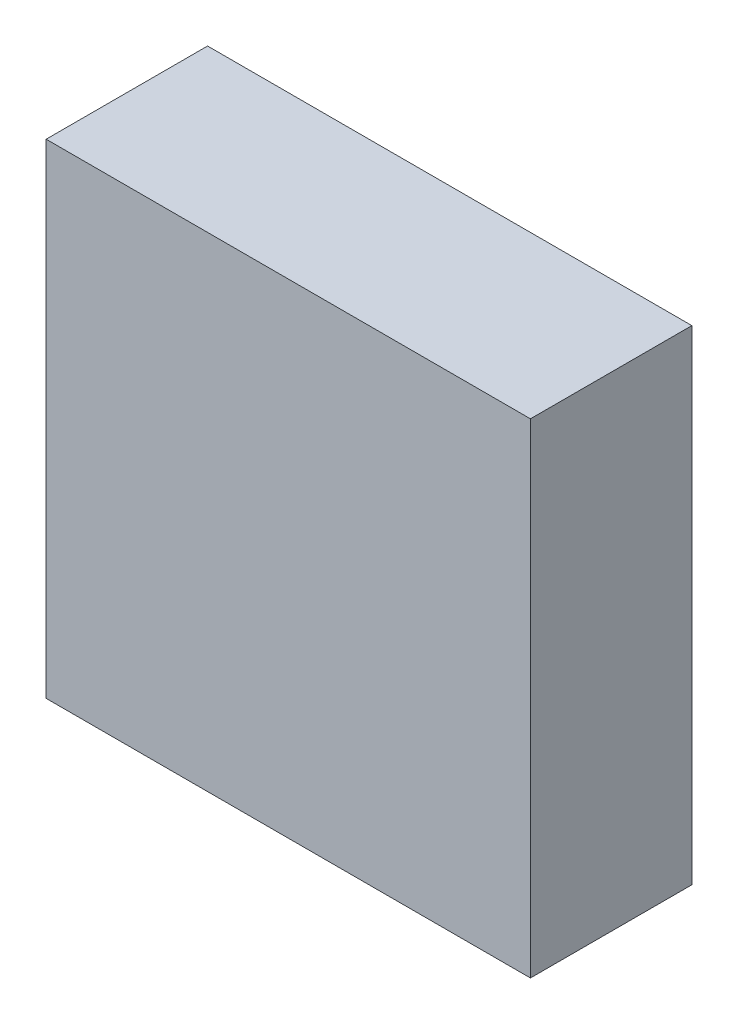
ISO-10303-21;
HEADER;
FILE_DESCRIPTION(('STEP AP214'),'2;1');
FILE_NAME('part.step','',(''),(''),'','','');
FILE_SCHEMA(('AUTOMOTIVE_DESIGN { 1 0 10303 214 1 1 1 1 }'));
ENDSEC;
DATA;
#1=APPLICATION_CONTEXT('core data for automotive mechanical design processes');
#2=APPLICATION_PROTOCOL_DEFINITION('international standard','automotive_design',2000,#1);
#3=PRODUCT_CONTEXT('',#1,'mechanical');
#4=PRODUCT('Part','Part','',(#3));
#5=PRODUCT_RELATED_PRODUCT_CATEGORY('part','',(#4));
#6=PRODUCT_DEFINITION_FORMATION('','',#4);
#7=PRODUCT_DEFINITION_CONTEXT('part definition',#1,'design');
#8=PRODUCT_DEFINITION('design','',#6,#7);
#9=PRODUCT_DEFINITION_SHAPE('','',#8);
#10=(LENGTH_UNIT() NAMED_UNIT(*) SI_UNIT(.MILLI.,.METRE.));
#11=(NAMED_UNIT(*) PLANE_ANGLE_UNIT() SI_UNIT($,.RADIAN.));
#12=(NAMED_UNIT(*) SI_UNIT($,.STERADIAN.) SOLID_ANGLE_UNIT());
#13=UNCERTAINTY_MEASURE_WITH_UNIT(LENGTH_MEASURE(1.E-05),#10,'distance_accuracy_value','');
#14=(GEOMETRIC_REPRESENTATION_CONTEXT(3) GLOBAL_UNCERTAINTY_ASSIGNED_CONTEXT((#13)) GLOBAL_UNIT_ASSIGNED_CONTEXT((#10,
#11,#12)) REPRESENTATION_CONTEXT('',''));
#15=CARTESIAN_POINT('',(0.,0.,0.));
#16=DIRECTION('',(0.,0.,1.));
#17=DIRECTION('',(1.,0.,0.));
#18=AXIS2_PLACEMENT_3D('',#15,#16,#17);
#19=CARTESIAN_POINT('',(0.,0.,20.));
#20=DIRECTION('',(1.,0.,0.));
#21=DIRECTION('',(0.,0.,-1.));
#22=AXIS2_PLACEMENT_3D('',#19,#20,#21);
#23=PLANE('',#22);
#24=DIRECTION('',(0.,-1.,0.));
#25=VECTOR('',#24,1.);
#26=CARTESIAN_POINT('',(0.,0.,0.));
#27=LINE('',#26,#25);
#28=CARTESIAN_POINT('',(0.,60.,0.));
#29=VERTEX_POINT('',#28);
#30=CARTESIAN_POINT('',(0.,0.,0.));
#31=VERTEX_POINT('',#30);
#32=EDGE_CURVE('E102',#29,#31,#27,.T.);
#33=ORIENTED_EDGE('',*,*,#32,.T.);
#34=DIRECTION('',(0.,0.,-1.));
#35=VECTOR('',#34,1.);
#36=CARTESIAN_POINT('',(0.,0.,20.));
#37=LINE('',#36,#35);
#38=CARTESIAN_POINT('',(0.,0.,20.));
#39=VERTEX_POINT('',#38);
#40=EDGE_CURVE('E11',#39,#31,#37,.T.);
#41=ORIENTED_EDGE('',*,*,#40,.F.);
#42=DIRECTION('',(0.,-1.,0.));
#43=VECTOR('',#42,1.);
#44=CARTESIAN_POINT('',(0.,0.,20.));
#45=LINE('',#44,#43);
#46=CARTESIAN_POINT('',(0.,60.,20.));
#47=VERTEX_POINT('',#46);
#48=EDGE_CURVE('E90',#47,#39,#45,.T.);
#49=ORIENTED_EDGE('',*,*,#48,.F.);
#50=DIRECTION('',(0.,0.,-1.));
#51=VECTOR('',#50,1.);
#52=CARTESIAN_POINT('',(0.,60.,20.));
#53=LINE('',#52,#51);
#54=EDGE_CURVE('E98',#47,#29,#53,.T.);
#55=ORIENTED_EDGE('',*,*,#54,.T.);
#56=EDGE_LOOP('',(#33,#41,#49,#55));
#57=FACE_BOUND('',#56,.T.);
#58=ADVANCED_FACE('F39',(#57),#23,.F.);
#59=CARTESIAN_POINT('',(0.,0.,20.));
#60=DIRECTION('',(0.,1.,0.));
#61=DIRECTION('',(0.,0.,1.));
#62=AXIS2_PLACEMENT_3D('',#59,#60,#61);
#63=PLANE('',#62);
#64=DIRECTION('',(1.,0.,0.));
#65=VECTOR('',#64,1.);
#66=CARTESIAN_POINT('',(0.,0.,0.));
#67=LINE('',#66,#65);
#68=CARTESIAN_POINT('',(60.,0.,0.));
#69=VERTEX_POINT('',#68);
#70=EDGE_CURVE('E94',#31,#69,#67,.T.);
#71=ORIENTED_EDGE('',*,*,#70,.T.);
#72=DIRECTION('',(0.,0.,-1.));
#73=VECTOR('',#72,1.);
#74=CARTESIAN_POINT('',(60.,0.,20.));
#75=LINE('',#74,#73);
#76=CARTESIAN_POINT('',(60.,0.,20.));
#77=VERTEX_POINT('',#76);
#78=EDGE_CURVE('E47',#77,#69,#75,.T.);
#79=ORIENTED_EDGE('',*,*,#78,.F.);
#80=DIRECTION('',(1.,0.,0.));
#81=VECTOR('',#80,1.);
#82=CARTESIAN_POINT('',(0.,0.,20.));
#83=LINE('',#82,#81);
#84=EDGE_CURVE('E85',#39,#77,#83,.T.);
#85=ORIENTED_EDGE('',*,*,#84,.F.);
#86=ORIENTED_EDGE('',*,*,#40,.T.);
#87=EDGE_LOOP('',(#71,#79,#85,#86));
#88=FACE_BOUND('',#87,.T.);
#89=ADVANCED_FACE('F93',(#88),#63,.F.);
#90=CARTESIAN_POINT('',(60.,0.,20.));
#91=DIRECTION('',(-1.,0.,0.));
#92=DIRECTION('',(0.,0.,1.));
#93=AXIS2_PLACEMENT_3D('',#90,#91,#92);
#94=PLANE('',#93);
#95=DIRECTION('',(0.,1.,0.));
#96=VECTOR('',#95,1.);
#97=CARTESIAN_POINT('',(60.,0.,0.));
#98=LINE('',#97,#96);
#99=CARTESIAN_POINT('',(60.,60.,0.));
#100=VERTEX_POINT('',#99);
#101=EDGE_CURVE('E72',#69,#100,#98,.T.);
#102=ORIENTED_EDGE('',*,*,#101,.T.);
#103=DIRECTION('',(0.,0.,-1.));
#104=VECTOR('',#103,1.);
#105=CARTESIAN_POINT('',(60.,60.,20.));
#106=LINE('',#105,#104);
#107=CARTESIAN_POINT('',(60.,60.,20.));
#108=VERTEX_POINT('',#107);
#109=EDGE_CURVE('E95',#108,#100,#106,.T.);
#110=ORIENTED_EDGE('',*,*,#109,.F.);
#111=DIRECTION('',(0.,1.,0.));
#112=VECTOR('',#111,1.);
#113=CARTESIAN_POINT('',(60.,0.,20.));
#114=LINE('',#113,#112);
#115=EDGE_CURVE('E88',#77,#108,#114,.T.);
#116=ORIENTED_EDGE('',*,*,#115,.F.);
#117=ORIENTED_EDGE('',*,*,#78,.T.);
#118=EDGE_LOOP('',(#102,#110,#116,#117));
#119=FACE_BOUND('',#118,.T.);
#120=ADVANCED_FACE('F96',(#119),#94,.F.);
#121=CARTESIAN_POINT('',(0.,60.,20.));
#122=DIRECTION('',(0.,-1.,0.));
#123=DIRECTION('',(0.,0.,-1.));
#124=AXIS2_PLACEMENT_3D('',#121,#122,#123);
#125=PLANE('',#124);
#126=DIRECTION('',(-1.,0.,0.));
#127=VECTOR('',#126,1.);
#128=CARTESIAN_POINT('',(0.,60.,0.));
#129=LINE('',#128,#127);
#130=EDGE_CURVE('E78',#100,#29,#129,.T.);
#131=ORIENTED_EDGE('',*,*,#130,.T.);
#132=ORIENTED_EDGE('',*,*,#54,.F.);
#133=DIRECTION('',(-1.,0.,0.));
#134=VECTOR('',#133,1.);
#135=CARTESIAN_POINT('',(0.,60.,20.));
#136=LINE('',#135,#134);
#137=EDGE_CURVE('E55',#108,#47,#136,.T.);
#138=ORIENTED_EDGE('',*,*,#137,.F.);
#139=ORIENTED_EDGE('',*,*,#109,.T.);
#140=EDGE_LOOP('',(#131,#132,#138,#139));
#141=FACE_BOUND('',#140,.T.);
#142=ADVANCED_FACE('F109',(#141),#125,.F.);
#143=CARTESIAN_POINT('',(0.,0.,20.));
#144=DIRECTION('',(0.,0.,-1.));
#145=DIRECTION('',(-1.,0.,0.));
#146=AXIS2_PLACEMENT_3D('',#143,#144,#145);
#147=PLANE('',#146);
#148=ORIENTED_EDGE('',*,*,#48,.T.);
#149=ORIENTED_EDGE('',*,*,#84,.T.);
#150=ORIENTED_EDGE('',*,*,#115,.T.);
#151=ORIENTED_EDGE('',*,*,#137,.T.);
#152=EDGE_LOOP('',(#148,#149,#150,#151));
#153=FACE_BOUND('',#152,.T.);
#154=ADVANCED_FACE('F86',(#153),#147,.F.);
#155=CARTESIAN_POINT('',(0.,0.,0.));
#156=DIRECTION('',(0.,0.,-1.));
#157=DIRECTION('',(-1.,0.,0.));
#158=AXIS2_PLACEMENT_3D('',#155,#156,#157);
#159=PLANE('',#158);
#160=ORIENTED_EDGE('',*,*,#32,.F.);
#161=ORIENTED_EDGE('',*,*,#130,.F.);
#162=ORIENTED_EDGE('',*,*,#101,.F.);
#163=ORIENTED_EDGE('',*,*,#70,.F.);
#164=EDGE_LOOP('',(#160,#161,#162,#163));
#165=FACE_BOUND('',#164,.T.);
#166=ADVANCED_FACE('F112',(#165),#159,.T.);
#167=CLOSED_SHELL('',(#58,#89,#120,#142,#154,#166));
#168=MANIFOLD_SOLID_BREP('B2',#167);
#169=ADVANCED_BREP_SHAPE_REPRESENTATION('',(#18,#168),#14);
#170=SHAPE_DEFINITION_REPRESENTATION(#9,#169);
ENDSEC;
END-ISO-10303-21;
